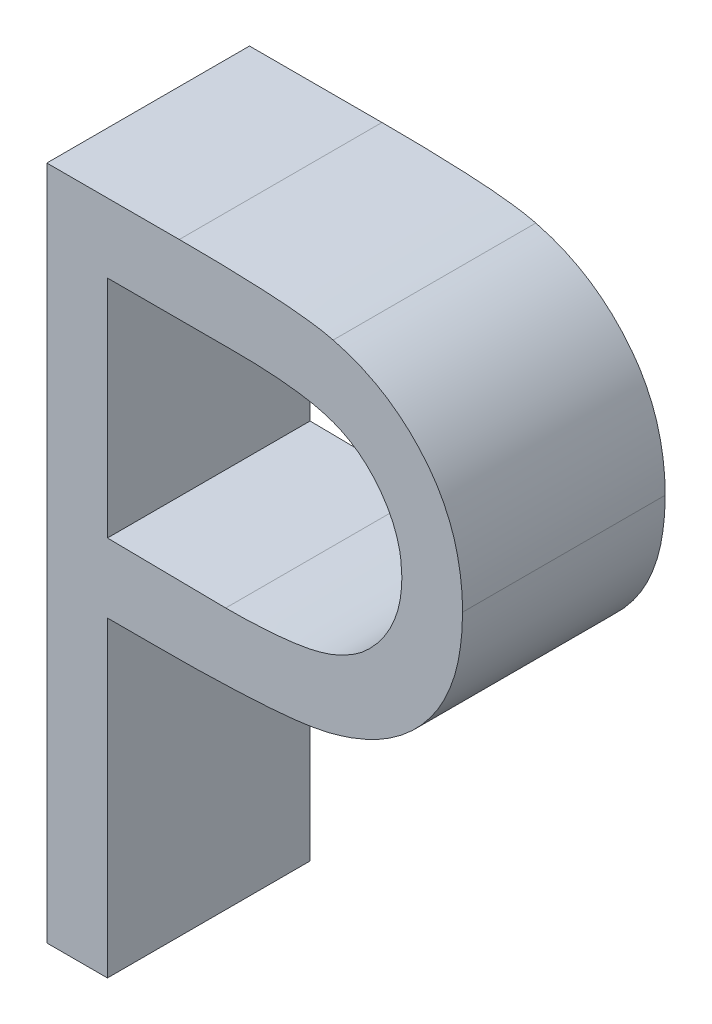
ISO-10303-21;
HEADER;
FILE_DESCRIPTION(('STEP AP214'),'2;1');
FILE_NAME('part.step','',(''),(''),'','','');
FILE_SCHEMA(('AUTOMOTIVE_DESIGN { 1 0 10303 214 1 1 1 1 }'));
ENDSEC;
DATA;
#1=APPLICATION_CONTEXT('core data for automotive mechanical design processes');
#2=APPLICATION_PROTOCOL_DEFINITION('international standard','automotive_design',2000,#1);
#3=PRODUCT_CONTEXT('',#1,'mechanical');
#4=PRODUCT('Part','Part','',(#3));
#5=PRODUCT_RELATED_PRODUCT_CATEGORY('part','',(#4));
#6=PRODUCT_DEFINITION_FORMATION('','',#4);
#7=PRODUCT_DEFINITION_CONTEXT('part definition',#1,'design');
#8=PRODUCT_DEFINITION('design','',#6,#7);
#9=PRODUCT_DEFINITION_SHAPE('','',#8);
#10=(LENGTH_UNIT() NAMED_UNIT(*) SI_UNIT(.MILLI.,.METRE.));
#11=(NAMED_UNIT(*) PLANE_ANGLE_UNIT() SI_UNIT($,.RADIAN.));
#12=(NAMED_UNIT(*) SI_UNIT($,.STERADIAN.) SOLID_ANGLE_UNIT());
#13=UNCERTAINTY_MEASURE_WITH_UNIT(LENGTH_MEASURE(1.E-05),#10,'distance_accuracy_value','');
#14=(GEOMETRIC_REPRESENTATION_CONTEXT(3) GLOBAL_UNCERTAINTY_ASSIGNED_CONTEXT((#13)) GLOBAL_UNIT_ASSIGNED_CONTEXT((#10,
#11,#12)) REPRESENTATION_CONTEXT('',''));
#15=CARTESIAN_POINT('',(0.,0.,0.));
#16=DIRECTION('',(0.,0.,1.));
#17=DIRECTION('',(1.,0.,0.));
#18=AXIS2_PLACEMENT_3D('',#15,#16,#17);
#19=CARTESIAN_POINT('',(-53.880379763694,-17.8818385258969,1.5));
#20=DIRECTION('',(0.,0.,1.));
#21=DIRECTION('',(1.,0.,0.));
#22=AXIS2_PLACEMENT_3D('',#19,#20,#21);
#23=PLANE('',#22);
#24=DIRECTION('',(0.,1.,0.));
#25=VECTOR('',#24,1.);
#26=CARTESIAN_POINT('',(-55.4324653258695,-22.8701190762308,1.5));
#27=LINE('',#26,#25);
#28=CARTESIAN_POINT('',(-55.4324653258695,-22.8701190762308,1.5));
#29=VERTEX_POINT('',#28);
#30=CARTESIAN_POINT('',(-55.4324653258695,-17.8701190762308,1.5));
#31=VERTEX_POINT('',#30);
#32=EDGE_CURVE('E284',#29,#31,#27,.T.);
#33=ORIENTED_EDGE('',*,*,#32,.F.);
#34=DIRECTION('',(-1.,0.,0.));
#35=VECTOR('',#34,1.);
#36=CARTESIAN_POINT('',(-54.9837473771516,-22.8701190762308,1.5));
#37=LINE('',#36,#35);
#38=CARTESIAN_POINT('',(-54.9837473771516,-22.8701190762308,1.5));
#39=VERTEX_POINT('',#38);
#40=EDGE_CURVE('E236',#39,#29,#37,.T.);
#41=ORIENTED_EDGE('',*,*,#40,.F.);
#42=DIRECTION('',(0.,-1.,0.));
#43=VECTOR('',#42,1.);
#44=CARTESIAN_POINT('',(-54.9837473771516,-20.5624267685385,1.5));
#45=LINE('',#44,#43);
#46=CARTESIAN_POINT('',(-54.9837473771516,-20.5624267685385,1.5));
#47=VERTEX_POINT('',#46);
#48=EDGE_CURVE('E233',#47,#39,#45,.T.);
#49=ORIENTED_EDGE('',*,*,#48,.F.);
#50=DIRECTION('',(-1.,0.,0.));
#51=VECTOR('',#50,1.);
#52=CARTESIAN_POINT('',(-54.626175261767,-20.5624267685385,1.5));
#53=LINE('',#52,#51);
#54=CARTESIAN_POINT('',(-54.626175261767,-20.5624267685385,1.5));
#55=VERTEX_POINT('',#54);
#56=EDGE_CURVE('E222',#55,#47,#53,.T.);
#57=ORIENTED_EDGE('',*,*,#56,.F.);
#58=CARTESIAN_POINT('',(-53.3531384027926,-20.4802953582821,1.5));
#59=CARTESIAN_POINT('',(-53.3844631656375,-20.486956759822,1.5));
#60=CARTESIAN_POINT('',(-53.4531132047241,-20.5015556086096,1.5));
#61=CARTESIAN_POINT('',(-53.5661742364066,-20.5178534041023,1.5));
#62=CARTESIAN_POINT('',(-53.6978105020206,-20.5317642622244,1.5));
#63=CARTESIAN_POINT('',(-53.8478423304714,-20.5421944587687,1.5));
#64=CARTESIAN_POINT('',(-54.016135051788,-20.5511235565716,1.5));
#65=CARTESIAN_POINT('',(-54.2027797051161,-20.5582208335583,1.5));
#66=CARTESIAN_POINT('',(-54.4081426725152,-20.5621206247514,1.5));
#67=CARTESIAN_POINT('',(-54.5513873069122,-20.5623217573206,1.5));
#68=CARTESIAN_POINT('',(-54.626175261767,-20.5624267685385,1.5));
#69=B_SPLINE_CURVE_WITH_KNOTS('',3,(#58,#59,#60,#61,#62,#63,#64,#65,#66,#67,#68),.UNSPECIFIED.,
.F.,.F.,(4,1,1,1,1,1,1,1,4),(0.,0.0751731173762235,0.164746257511804,0.268016880987782,
0.385911875652958,0.517789479273397,0.663690977002278,0.82441322053664,1.),.UNSPECIFIED.);
#70=CARTESIAN_POINT('',(-53.3531384027926,-20.4802953582821,1.5));
#71=VERTEX_POINT('',#70);
#72=EDGE_CURVE('E216',#71,#55,#69,.T.);
#73=ORIENTED_EDGE('',*,*,#72,.F.);
#74=CARTESIAN_POINT('',(-52.3555422489465,-19.2112649095642,1.5));
#75=CARTESIAN_POINT('',(-52.3561442842735,-19.2523760192606,1.5));
#76=CARTESIAN_POINT('',(-52.3573222070527,-19.3328126820398,1.5));
#77=CARTESIAN_POINT('',(-52.3714597575224,-19.4504880937379,1.5));
#78=CARTESIAN_POINT('',(-52.3905028884063,-19.5629429367831,1.5));
#79=CARTESIAN_POINT('',(-52.4197843917309,-19.6699278660251,1.5));
#80=CARTESIAN_POINT('',(-52.4581353533,-19.7708075381262,1.5));
#81=CARTESIAN_POINT('',(-52.5031240002224,-19.8671235838701,1.5));
#82=CARTESIAN_POINT('',(-52.557386186465,-19.9572374008681,1.5));
#83=CARTESIAN_POINT('',(-52.6197359431943,-20.0414761402133,1.5));
#84=CARTESIAN_POINT('',(-52.6890953637555,-20.1199188720907,1.5));
#85=CARTESIAN_POINT('',(-52.7651709896802,-20.1919971499374,1.5));
#86=CARTESIAN_POINT('',(-52.847655693252,-20.2572890619696,1.5));
#87=CARTESIAN_POINT('',(-52.9362873333611,-20.315940981513,1.5));
#88=CARTESIAN_POINT('',(-53.0319299745561,-20.3665928093669,1.5));
#89=CARTESIAN_POINT('',(-53.1331330510861,-20.4119603878319,1.5));
#90=CARTESIAN_POINT('',(-53.2407762174031,-20.4500619030298,1.5));
#91=CARTESIAN_POINT('',(-53.3152655230822,-20.4701048479246,1.5));
#92=CARTESIAN_POINT('',(-53.3531384027926,-20.4802953582821,1.5));
#93=B_SPLINE_CURVE_WITH_KNOTS('',3,(#74,#75,#76,#77,#78,#79,#80,#81,#82,#83,#84,#85,#86,#87,#88,
#89,#90,#91,#92),.UNSPECIFIED.,.F.,.F.,(4,1,1,1,1,1,1,1,1,1,1,1,1,1,1,1,4),(0.,
0.0701188944197139,0.137192352785971,0.202016180724751,0.264631406974744,0.326116547145818,
0.386010304667642,0.44581184695768,0.50529769673096,0.564633277726489,0.624282625333839,
0.683902031903749,0.743952770938272,0.805387731007635,0.86838803089628,0.933084028252476,1.),.UNSPECIFIED.);
#94=CARTESIAN_POINT('',(-52.3555422489465,-19.2112649095642,1.5));
#95=VERTEX_POINT('',#94);
#96=EDGE_CURVE('E223',#95,#71,#93,.T.);
#97=ORIENTED_EDGE('',*,*,#96,.F.);
#98=CARTESIAN_POINT('',(-53.3130743002285,-17.9452392685385,1.5));
#99=CARTESIAN_POINT('',(-53.2785121091067,-17.9546991968695,1.5));
#100=CARTESIAN_POINT('',(-53.2102021416608,-17.9733961421544,1.5));
#101=CARTESIAN_POINT('',(-53.111772080087,-18.0108443185482,1.5));
#102=CARTESIAN_POINT('',(-53.0181237294008,-18.055247411656,1.5));
#103=CARTESIAN_POINT('',(-52.9289357887648,-18.1058530400145,1.5));
#104=CARTESIAN_POINT('',(-52.8453042415207,-18.1648324174247,1.5));
#105=CARTESIAN_POINT('',(-52.765981325855,-18.2297947284808,1.5));
#106=CARTESIAN_POINT('',(-52.6916670682897,-18.3022398264414,1.5));
#107=CARTESIAN_POINT('',(-52.622779365598,-18.3813551690806,1.5));
#108=CARTESIAN_POINT('',(-52.5595153690495,-18.4658126117684,1.5));
#109=CARTESIAN_POINT('',(-52.505044393725,-18.5568729402077,1.5));
#110=CARTESIAN_POINT('',(-52.4594340693917,-18.6530033736646,1.5));
#111=CARTESIAN_POINT('',(-52.4203151101286,-18.7541370467465,1.5));
#112=CARTESIAN_POINT('',(-52.3921601751726,-18.8611232231627,1.5));
#113=CARTESIAN_POINT('',(-52.3709503184506,-18.9732185265544,1.5));
#114=CARTESIAN_POINT('',(-52.3574879932854,-19.090410941128,1.5));
#115=CARTESIAN_POINT('',(-52.3561986193494,-19.1704964661578,1.5));
#116=CARTESIAN_POINT('',(-52.3555422489465,-19.2112649095642,1.5));
#117=B_SPLINE_CURVE_WITH_KNOTS('',3,(#98,#99,#100,#101,#102,#103,#104,#105,#106,#107,#108,#109,
#110,#111,#112,#113,#114,#115,#116),.UNSPECIFIED.,.F.,.F.,(4,1,1,1,1,1,1,1,1,1,1,1,1,1,1,1,4),
(0.,0.0624813386352062,0.123490382687291,0.183411094206312,0.243153220999781,0.302126735372086,
0.361709670832908,0.421842291694879,0.482931901446669,0.544552254431324,0.605680719965359,
0.667679738343688,0.729984387538063,0.794550921286128,0.860345619712081,0.928907356265708,1.),.UNSPECIFIED.);
#118=CARTESIAN_POINT('',(-53.3130743002285,-17.9452392685385,1.5));
#119=VERTEX_POINT('',#118);
#120=EDGE_CURVE('E322',#119,#95,#117,.T.);
#121=ORIENTED_EDGE('',*,*,#120,.F.);
#122=CARTESIAN_POINT('',(-54.4518964156131,-17.8701190762308,1.5));
#123=CARTESIAN_POINT('',(-54.3844522639679,-17.8701932137177,1.5));
#124=CARTESIAN_POINT('',(-54.2552262742383,-17.8703352644351,1.5));
#125=CARTESIAN_POINT('',(-54.0699190517971,-17.874642044186,1.5));
#126=CARTESIAN_POINT('',(-53.901619435188,-17.8803944614614,1.5));
#127=CARTESIAN_POINT('',(-53.7506903195784,-17.8883685945944,1.5));
#128=CARTESIAN_POINT('',(-53.6166673223119,-17.897792294948,1.5));
#129=CARTESIAN_POINT('',(-53.5001568943882,-17.9110094940586,1.5));
#130=CARTESIAN_POINT('',(-53.4002432424827,-17.9248099162777,1.5));
#131=CARTESIAN_POINT('',(-53.3403768861305,-17.9388404970197,1.5));
#132=CARTESIAN_POINT('',(-53.3130743002285,-17.9452392685385,1.5));
#133=B_SPLINE_CURVE_WITH_KNOTS('',3,(#122,#123,#124,#125,#126,#127,#128,#129,#130,#131,#132),
.UNSPECIFIED.,.F.,.F.,(4,1,1,1,1,1,1,1,4),(0.,0.176955752131251,0.339055079642578,
0.486318224942078,0.618780922835379,0.735618827767378,0.838742476720111,0.926457067876317,1.),.UNSPECIFIED.);
#134=CARTESIAN_POINT('',(-54.4518964156131,-17.8701190762308,1.5));
#135=VERTEX_POINT('',#134);
#136=EDGE_CURVE('E314',#135,#119,#133,.T.);
#137=ORIENTED_EDGE('',*,*,#136,.F.);
#138=DIRECTION('',(1.,0.,0.));
#139=VECTOR('',#138,1.);
#140=CARTESIAN_POINT('',(-55.4324653258695,-17.8701190762308,1.5));
#141=LINE('',#140,#139);
#142=EDGE_CURVE('E312',#31,#135,#141,.T.);
#143=ORIENTED_EDGE('',*,*,#142,.F.);
#144=EDGE_LOOP('',(#33,#41,#49,#57,#73,#97,#121,#137,#143));
#145=FACE_BOUND('',#144,.T.);
#146=DIRECTION('',(0.,-1.,0.));
#147=VECTOR('',#146,1.);
#148=CARTESIAN_POINT('',(-54.9837473771516,-18.3829395890513,1.5));
#149=LINE('',#148,#147);
#150=CARTESIAN_POINT('',(-54.9837473771516,-18.3829395890513,1.5));
#151=VERTEX_POINT('',#150);
#152=CARTESIAN_POINT('',(-54.9837473771516,-20.049606255718,1.5));
#153=VERTEX_POINT('',#152);
#154=EDGE_CURVE('E143',#151,#153,#149,.T.);
#155=ORIENTED_EDGE('',*,*,#154,.F.);
#156=DIRECTION('',(-1.,0.,0.));
#157=VECTOR('',#156,1.);
#158=CARTESIAN_POINT('',(-54.0692842361259,-18.3829395890513,1.5));
#159=LINE('',#158,#157);
#160=CARTESIAN_POINT('',(-54.0692842361259,-18.3829395890513,1.5));
#161=VERTEX_POINT('',#160);
#162=EDGE_CURVE('E135',#161,#151,#159,.T.);
#163=ORIENTED_EDGE('',*,*,#162,.F.);
#164=CARTESIAN_POINT('',(-52.8042601976644,-19.2132681146924,1.5));
#165=CARTESIAN_POINT('',(-52.8060639783723,-19.1730702383368,1.5));
#166=CARTESIAN_POINT('',(-52.8096496711736,-19.0931618352571,1.5));
#167=CARTESIAN_POINT('',(-52.8363009042603,-18.9760493201003,1.5));
#168=CARTESIAN_POINT('',(-52.881085638351,-18.8642840281192,1.5));
#169=CARTESIAN_POINT('',(-52.943166487658,-18.7600367633286,1.5));
#170=CARTESIAN_POINT('',(-53.0185109590303,-18.6654813290925,1.5));
#171=CARTESIAN_POINT('',(-53.1060814491846,-18.5833425761456,1.5));
#172=CARTESIAN_POINT('',(-53.2056718225184,-18.517311572244,1.5));
#173=CARTESIAN_POINT('',(-53.2983121525652,-18.4746925984602,1.5));
#174=CARTESIAN_POINT('',(-53.3805995611758,-18.4486707764128,1.5));
#175=CARTESIAN_POINT('',(-53.4520737895812,-18.4304638614739,1.5));
#176=CARTESIAN_POINT('',(-53.5327747531331,-18.415927281124,1.5));
#177=CARTESIAN_POINT('',(-53.6227287238622,-18.4041565628437,1.5));
#178=CARTESIAN_POINT('',(-53.7212384865485,-18.3940801896675,1.5));
#179=CARTESIAN_POINT('',(-53.8291503649694,-18.3872430793332,1.5));
#180=CARTESIAN_POINT('',(-53.9460555696328,-18.3832409989953,1.5));
#181=CARTESIAN_POINT('',(-54.0272135280114,-18.3830424914858,1.5));
#182=CARTESIAN_POINT('',(-54.0692842361259,-18.3829395890513,1.5));
#183=B_SPLINE_CURVE_WITH_KNOTS('',3,(#164,#165,#166,#167,#168,#169,#170,#171,#172,#173,#174,
#175,#176,#177,#178,#179,#180,#181,#182),.UNSPECIFIED.,.F.,.F.,(4,1,1,1,1,1,1,1,1,1,1,1,1,1,1,1,
4),(0.,0.0700437554181556,0.139238316762646,0.208197455044138,0.279173374424568,
0.349986811686477,0.418353845662657,0.487609583757152,0.557411073108388,0.595330156763242,
0.637964051565221,0.685912777711294,0.73818516465248,0.796102647184943,0.858516543946926,
0.926657726468521,1.),.UNSPECIFIED.);
#184=CARTESIAN_POINT('',(-52.8042601976644,-19.2132681146924,1.5));
#185=VERTEX_POINT('',#184);
#186=EDGE_CURVE('E165',#185,#161,#183,.T.);
#187=ORIENTED_EDGE('',*,*,#186,.F.);
#188=CARTESIAN_POINT('',(-54.1083467361259,-20.0606238839231,1.5));
#189=CARTESIAN_POINT('',(-54.0656039849647,-20.0606459747676,1.5));
#190=CARTESIAN_POINT('',(-53.9830899850608,-20.0606886206875,1.5));
#191=CARTESIAN_POINT('',(-53.8638953804419,-20.0549954442886,1.5));
#192=CARTESIAN_POINT('',(-53.7533106842946,-20.048423254768,1.5));
#193=CARTESIAN_POINT('',(-53.6516755766185,-20.0388005069652,1.5));
#194=CARTESIAN_POINT('',(-53.5589442416423,-20.0251987105592,1.5));
#195=CARTESIAN_POINT('',(-53.474962057536,-20.0114676563904,1.5));
#196=CARTESIAN_POINT('',(-53.4003802248289,-19.9916028526782,1.5));
#197=CARTESIAN_POINT('',(-53.3130956508778,-19.9648556110509,1.5));
#198=CARTESIAN_POINT('',(-53.2158337259109,-19.919237588678,1.5));
#199=CARTESIAN_POINT('',(-53.1100229423063,-19.8530234600301,1.5));
#200=CARTESIAN_POINT('',(-53.0203506760902,-19.7686224483157,1.5));
#201=CARTESIAN_POINT('',(-52.942753109288,-19.6737255464207,1.5));
#202=CARTESIAN_POINT('',(-52.8811732836617,-19.5681553615263,1.5));
#203=CARTESIAN_POINT('',(-52.8360932946382,-19.455199737632,1.5));
#204=CARTESIAN_POINT('',(-52.809605926976,-19.3360170954581,1.5));
#205=CARTESIAN_POINT('',(-52.8060542217536,-19.2544626113793,1.5));
#206=CARTESIAN_POINT('',(-52.8042601976644,-19.2132681146924,1.5));
#207=B_SPLINE_CURVE_WITH_KNOTS('',3,(#188,#189,#190,#191,#192,#193,#194,#195,#196,#197,#198,
#199,#200,#201,#202,#203,#204,#205,#206),.UNSPECIFIED.,.F.,.F.,(4,1,1,1,1,1,1,1,1,1,1,1,1,1,1,1,
4),(0.,0.0725383714064926,0.14003383050125,0.202495680633622,0.260575055669414,
0.313228337846465,0.361583193753266,0.404878361295125,0.44412743730554,0.516399693337197,
0.586506670997767,0.655085373796049,0.724383783147036,0.793973528725663,0.861637682181778,
0.930110942306403,1.),.UNSPECIFIED.);
#208=CARTESIAN_POINT('',(-54.1083467361259,-20.0606238839231,1.5));
#209=VERTEX_POINT('',#208);
#210=EDGE_CURVE('E158',#209,#185,#207,.T.);
#211=ORIENTED_EDGE('',*,*,#210,.F.);
#212=DIRECTION('',(0.999920808071693,-0.0125848156622303,0.));
#213=VECTOR('',#212,1.);
#214=CARTESIAN_POINT('',(-54.9837473771516,-20.049606255718,1.5));
#215=LINE('',#214,#213);
#216=EDGE_CURVE('E156',#153,#209,#215,.T.);
#217=ORIENTED_EDGE('',*,*,#216,.F.);
#218=EDGE_LOOP('',(#155,#163,#187,#211,#217));
#219=FACE_BOUND('',#218,.T.);
#220=ADVANCED_FACE('F33',(#145,#219),#23,.T.);
#221=CARTESIAN_POINT('',(-53.880379763694,-17.8818385258969,0.));
#222=DIRECTION('',(0.,0.,1.));
#223=DIRECTION('',(1.,0.,0.));
#224=AXIS2_PLACEMENT_3D('',#221,#222,#223);
#225=PLANE('',#224);
#226=DIRECTION('',(0.,1.,0.));
#227=VECTOR('',#226,1.);
#228=CARTESIAN_POINT('',(-55.4324653258695,-22.8701190762308,0.));
#229=LINE('',#228,#227);
#230=CARTESIAN_POINT('',(-55.4324653258695,-22.8701190762308,0.));
#231=VERTEX_POINT('',#230);
#232=CARTESIAN_POINT('',(-55.4324653258695,-17.8701190762308,0.));
#233=VERTEX_POINT('',#232);
#234=EDGE_CURVE('E151',#231,#233,#229,.T.);
#235=ORIENTED_EDGE('',*,*,#234,.T.);
#236=DIRECTION('',(1.,0.,0.));
#237=VECTOR('',#236,1.);
#238=CARTESIAN_POINT('',(-55.4324653258695,-17.8701190762308,0.));
#239=LINE('',#238,#237);
#240=CARTESIAN_POINT('',(-54.4518964156131,-17.8701190762308,0.));
#241=VERTEX_POINT('',#240);
#242=EDGE_CURVE('E241',#233,#241,#239,.T.);
#243=ORIENTED_EDGE('',*,*,#242,.T.);
#244=CARTESIAN_POINT('',(-54.4518964156131,-17.8701190762308,0.));
#245=CARTESIAN_POINT('',(-54.3844522639679,-17.8701932137177,0.));
#246=CARTESIAN_POINT('',(-54.2552262742383,-17.8703352644351,0.));
#247=CARTESIAN_POINT('',(-54.0699190517971,-17.874642044186,0.));
#248=CARTESIAN_POINT('',(-53.901619435188,-17.8803944614614,0.));
#249=CARTESIAN_POINT('',(-53.7506903195784,-17.8883685945944,0.));
#250=CARTESIAN_POINT('',(-53.6166673223119,-17.897792294948,0.));
#251=CARTESIAN_POINT('',(-53.5001568943882,-17.9110094940586,0.));
#252=CARTESIAN_POINT('',(-53.4002432424827,-17.9248099162777,0.));
#253=CARTESIAN_POINT('',(-53.3403768861305,-17.9388404970197,0.));
#254=CARTESIAN_POINT('',(-53.3130743002285,-17.9452392685385,0.));
#255=B_SPLINE_CURVE_WITH_KNOTS('',3,(#244,#245,#246,#247,#248,#249,#250,#251,#252,#253,#254),
.UNSPECIFIED.,.F.,.F.,(4,1,1,1,1,1,1,1,4),(0.,0.176955752131251,0.339055079642578,
0.486318224942078,0.618780922835379,0.735618827767378,0.838742476720111,0.926457067876317,1.),.UNSPECIFIED.);
#256=CARTESIAN_POINT('',(-53.3130743002285,-17.9452392685385,0.));
#257=VERTEX_POINT('',#256);
#258=EDGE_CURVE('E244',#241,#257,#255,.T.);
#259=ORIENTED_EDGE('',*,*,#258,.T.);
#260=CARTESIAN_POINT('',(-53.3130743002285,-17.9452392685385,0.));
#261=CARTESIAN_POINT('',(-53.2785121091067,-17.9546991968695,0.));
#262=CARTESIAN_POINT('',(-53.2102021416608,-17.9733961421544,0.));
#263=CARTESIAN_POINT('',(-53.111772080087,-18.0108443185482,0.));
#264=CARTESIAN_POINT('',(-53.0181237294008,-18.055247411656,0.));
#265=CARTESIAN_POINT('',(-52.9289357887648,-18.1058530400145,0.));
#266=CARTESIAN_POINT('',(-52.8453042415207,-18.1648324174247,0.));
#267=CARTESIAN_POINT('',(-52.765981325855,-18.2297947284808,0.));
#268=CARTESIAN_POINT('',(-52.6916670682897,-18.3022398264414,0.));
#269=CARTESIAN_POINT('',(-52.622779365598,-18.3813551690806,0.));
#270=CARTESIAN_POINT('',(-52.5595153690495,-18.4658126117684,0.));
#271=CARTESIAN_POINT('',(-52.505044393725,-18.5568729402077,0.));
#272=CARTESIAN_POINT('',(-52.4594340693917,-18.6530033736646,0.));
#273=CARTESIAN_POINT('',(-52.4203151101286,-18.7541370467465,0.));
#274=CARTESIAN_POINT('',(-52.3921601751726,-18.8611232231627,0.));
#275=CARTESIAN_POINT('',(-52.3709503184506,-18.9732185265544,0.));
#276=CARTESIAN_POINT('',(-52.3574879932854,-19.090410941128,0.));
#277=CARTESIAN_POINT('',(-52.3561986193494,-19.1704964661578,0.));
#278=CARTESIAN_POINT('',(-52.3555422489465,-19.2112649095642,0.));
#279=B_SPLINE_CURVE_WITH_KNOTS('',3,(#260,#261,#262,#263,#264,#265,#266,#267,#268,#269,#270,
#271,#272,#273,#274,#275,#276,#277,#278),.UNSPECIFIED.,.F.,.F.,(4,1,1,1,1,1,1,1,1,1,1,1,1,1,1,1,
4),(0.,0.0624813386352062,0.123490382687291,0.183411094206312,0.243153220999781,
0.302126735372086,0.361709670832908,0.421842291694879,0.482931901446669,0.544552254431324,
0.605680719965359,0.667679738343688,0.729984387538063,0.794550921286128,0.860345619712081,
0.928907356265708,1.),.UNSPECIFIED.);
#280=CARTESIAN_POINT('',(-52.3555422489465,-19.2112649095642,0.));
#281=VERTEX_POINT('',#280);
#282=EDGE_CURVE('E249',#257,#281,#279,.T.);
#283=ORIENTED_EDGE('',*,*,#282,.T.);
#284=CARTESIAN_POINT('',(-52.3555422489465,-19.2112649095642,0.));
#285=CARTESIAN_POINT('',(-52.3561442842735,-19.2523760192606,0.));
#286=CARTESIAN_POINT('',(-52.3573222070527,-19.3328126820398,0.));
#287=CARTESIAN_POINT('',(-52.3714597575224,-19.4504880937379,0.));
#288=CARTESIAN_POINT('',(-52.3905028884063,-19.5629429367831,0.));
#289=CARTESIAN_POINT('',(-52.4197843917309,-19.6699278660251,0.));
#290=CARTESIAN_POINT('',(-52.4581353533,-19.7708075381262,0.));
#291=CARTESIAN_POINT('',(-52.5031240002224,-19.8671235838701,0.));
#292=CARTESIAN_POINT('',(-52.557386186465,-19.9572374008681,0.));
#293=CARTESIAN_POINT('',(-52.6197359431943,-20.0414761402133,0.));
#294=CARTESIAN_POINT('',(-52.6890953637555,-20.1199188720907,0.));
#295=CARTESIAN_POINT('',(-52.7651709896802,-20.1919971499374,0.));
#296=CARTESIAN_POINT('',(-52.847655693252,-20.2572890619696,0.));
#297=CARTESIAN_POINT('',(-52.9362873333611,-20.315940981513,0.));
#298=CARTESIAN_POINT('',(-53.0319299745561,-20.3665928093669,0.));
#299=CARTESIAN_POINT('',(-53.1331330510861,-20.4119603878319,0.));
#300=CARTESIAN_POINT('',(-53.2407762174031,-20.4500619030298,0.));
#301=CARTESIAN_POINT('',(-53.3152655230822,-20.4701048479246,0.));
#302=CARTESIAN_POINT('',(-53.3531384027926,-20.4802953582821,0.));
#303=B_SPLINE_CURVE_WITH_KNOTS('',3,(#284,#285,#286,#287,#288,#289,#290,#291,#292,#293,#294,
#295,#296,#297,#298,#299,#300,#301,#302),.UNSPECIFIED.,.F.,.F.,(4,1,1,1,1,1,1,1,1,1,1,1,1,1,1,1,
4),(0.,0.0701188944197139,0.137192352785971,0.202016180724751,0.264631406974744,
0.326116547145818,0.386010304667642,0.44581184695768,0.50529769673096,0.564633277726489,
0.624282625333839,0.683902031903749,0.743952770938272,0.805387731007635,0.86838803089628,
0.933084028252476,1.),.UNSPECIFIED.);
#304=CARTESIAN_POINT('',(-53.3531384027926,-20.4802953582821,0.));
#305=VERTEX_POINT('',#304);
#306=EDGE_CURVE('E257',#281,#305,#303,.T.);
#307=ORIENTED_EDGE('',*,*,#306,.T.);
#308=CARTESIAN_POINT('',(-53.3531384027926,-20.4802953582821,0.));
#309=CARTESIAN_POINT('',(-53.3844631656375,-20.486956759822,0.));
#310=CARTESIAN_POINT('',(-53.4531132047241,-20.5015556086096,0.));
#311=CARTESIAN_POINT('',(-53.5661742364066,-20.5178534041023,0.));
#312=CARTESIAN_POINT('',(-53.6978105020206,-20.5317642622244,0.));
#313=CARTESIAN_POINT('',(-53.8478423304714,-20.5421944587687,0.));
#314=CARTESIAN_POINT('',(-54.016135051788,-20.5511235565716,0.));
#315=CARTESIAN_POINT('',(-54.2027797051161,-20.5582208335583,0.));
#316=CARTESIAN_POINT('',(-54.4081426725152,-20.5621206247514,0.));
#317=CARTESIAN_POINT('',(-54.5513873069122,-20.5623217573206,0.));
#318=CARTESIAN_POINT('',(-54.626175261767,-20.5624267685385,0.));
#319=B_SPLINE_CURVE_WITH_KNOTS('',3,(#308,#309,#310,#311,#312,#313,#314,#315,#316,#317,#318),
.UNSPECIFIED.,.F.,.F.,(4,1,1,1,1,1,1,1,4),(0.,0.0751731173762235,0.164746257511804,
0.268016880987782,0.385911875652958,0.517789479273397,0.663690977002278,0.82441322053664,1.),.UNSPECIFIED.);
#320=CARTESIAN_POINT('',(-54.626175261767,-20.5624267685385,0.));
#321=VERTEX_POINT('',#320);
#322=EDGE_CURVE('E265',#305,#321,#319,.T.);
#323=ORIENTED_EDGE('',*,*,#322,.T.);
#324=DIRECTION('',(-1.,0.,0.));
#325=VECTOR('',#324,1.);
#326=CARTESIAN_POINT('',(-54.626175261767,-20.5624267685385,0.));
#327=LINE('',#326,#325);
#328=CARTESIAN_POINT('',(-54.9837473771516,-20.5624267685385,0.));
#329=VERTEX_POINT('',#328);
#330=EDGE_CURVE('E273',#321,#329,#327,.T.);
#331=ORIENTED_EDGE('',*,*,#330,.T.);
#332=DIRECTION('',(0.,-1.,0.));
#333=VECTOR('',#332,1.);
#334=CARTESIAN_POINT('',(-54.9837473771516,-20.5624267685385,0.));
#335=LINE('',#334,#333);
#336=CARTESIAN_POINT('',(-54.9837473771516,-22.8701190762308,0.));
#337=VERTEX_POINT('',#336);
#338=EDGE_CURVE('E279',#329,#337,#335,.T.);
#339=ORIENTED_EDGE('',*,*,#338,.T.);
#340=DIRECTION('',(-1.,0.,0.));
#341=VECTOR('',#340,1.);
#342=CARTESIAN_POINT('',(-54.9837473771516,-22.8701190762308,0.));
#343=LINE('',#342,#341);
#344=EDGE_CURVE('E282',#337,#231,#343,.T.);
#345=ORIENTED_EDGE('',*,*,#344,.T.);
#346=EDGE_LOOP('',(#235,#243,#259,#283,#307,#323,#331,#339,#345));
#347=FACE_BOUND('',#346,.T.);
#348=DIRECTION('',(-1.,0.,0.));
#349=VECTOR('',#348,1.);
#350=CARTESIAN_POINT('',(-54.0692842361259,-18.3829395890513,0.));
#351=LINE('',#350,#349);
#352=CARTESIAN_POINT('',(-54.0692842361259,-18.3829395890513,0.));
#353=VERTEX_POINT('',#352);
#354=CARTESIAN_POINT('',(-54.9837473771516,-18.3829395890513,0.));
#355=VERTEX_POINT('',#354);
#356=EDGE_CURVE('E58',#353,#355,#351,.T.);
#357=ORIENTED_EDGE('',*,*,#356,.T.);
#358=DIRECTION('',(0.,-1.,0.));
#359=VECTOR('',#358,1.);
#360=CARTESIAN_POINT('',(-54.9837473771516,-18.3829395890513,0.));
#361=LINE('',#360,#359);
#362=CARTESIAN_POINT('',(-54.9837473771516,-20.049606255718,0.));
#363=VERTEX_POINT('',#362);
#364=EDGE_CURVE('E150',#355,#363,#361,.T.);
#365=ORIENTED_EDGE('',*,*,#364,.T.);
#366=DIRECTION('',(0.999920808071693,-0.0125848156622303,0.));
#367=VECTOR('',#366,1.);
#368=CARTESIAN_POINT('',(-54.9837473771516,-20.049606255718,0.));
#369=LINE('',#368,#367);
#370=CARTESIAN_POINT('',(-54.1083467361259,-20.0606238839231,0.));
#371=VERTEX_POINT('',#370);
#372=EDGE_CURVE('E478',#363,#371,#369,.T.);
#373=ORIENTED_EDGE('',*,*,#372,.T.);
#374=CARTESIAN_POINT('',(-54.1083467361259,-20.0606238839231,0.));
#375=CARTESIAN_POINT('',(-54.0656039849647,-20.0606459747676,0.));
#376=CARTESIAN_POINT('',(-53.9830899850608,-20.0606886206875,0.));
#377=CARTESIAN_POINT('',(-53.8638953804419,-20.0549954442886,0.));
#378=CARTESIAN_POINT('',(-53.7533106842946,-20.048423254768,0.));
#379=CARTESIAN_POINT('',(-53.6516755766185,-20.0388005069652,0.));
#380=CARTESIAN_POINT('',(-53.5589442416423,-20.0251987105592,0.));
#381=CARTESIAN_POINT('',(-53.474962057536,-20.0114676563904,0.));
#382=CARTESIAN_POINT('',(-53.4003802248289,-19.9916028526782,0.));
#383=CARTESIAN_POINT('',(-53.3130956508778,-19.9648556110509,0.));
#384=CARTESIAN_POINT('',(-53.2158337259109,-19.919237588678,0.));
#385=CARTESIAN_POINT('',(-53.1100229423063,-19.8530234600301,0.));
#386=CARTESIAN_POINT('',(-53.0203506760902,-19.7686224483157,0.));
#387=CARTESIAN_POINT('',(-52.942753109288,-19.6737255464207,0.));
#388=CARTESIAN_POINT('',(-52.8811732836617,-19.5681553615263,0.));
#389=CARTESIAN_POINT('',(-52.8360932946382,-19.455199737632,0.));
#390=CARTESIAN_POINT('',(-52.809605926976,-19.3360170954581,0.));
#391=CARTESIAN_POINT('',(-52.8060542217536,-19.2544626113793,0.));
#392=CARTESIAN_POINT('',(-52.8042601976644,-19.2132681146924,0.));
#393=B_SPLINE_CURVE_WITH_KNOTS('',3,(#374,#375,#376,#377,#378,#379,#380,#381,#382,#383,#384,
#385,#386,#387,#388,#389,#390,#391,#392),.UNSPECIFIED.,.F.,.F.,(4,1,1,1,1,1,1,1,1,1,1,1,1,1,1,1,
4),(0.,0.0725383714064926,0.14003383050125,0.202495680633622,0.260575055669414,
0.313228337846465,0.361583193753266,0.404878361295125,0.44412743730554,0.516399693337197,
0.586506670997767,0.655085373796049,0.724383783147036,0.793973528725663,0.861637682181778,
0.930110942306403,1.),.UNSPECIFIED.);
#394=CARTESIAN_POINT('',(-52.8042601976644,-19.2132681146924,0.));
#395=VERTEX_POINT('',#394);
#396=EDGE_CURVE('E473',#371,#395,#393,.T.);
#397=ORIENTED_EDGE('',*,*,#396,.T.);
#398=CARTESIAN_POINT('',(-52.8042601976644,-19.2132681146924,0.));
#399=CARTESIAN_POINT('',(-52.8060639783723,-19.1730702383368,0.));
#400=CARTESIAN_POINT('',(-52.8096496711736,-19.0931618352571,0.));
#401=CARTESIAN_POINT('',(-52.8363009042603,-18.9760493201003,0.));
#402=CARTESIAN_POINT('',(-52.881085638351,-18.8642840281192,0.));
#403=CARTESIAN_POINT('',(-52.943166487658,-18.7600367633286,0.));
#404=CARTESIAN_POINT('',(-53.0185109590303,-18.6654813290925,0.));
#405=CARTESIAN_POINT('',(-53.1060814491846,-18.5833425761456,0.));
#406=CARTESIAN_POINT('',(-53.2056718225184,-18.517311572244,0.));
#407=CARTESIAN_POINT('',(-53.2983121525652,-18.4746925984602,0.));
#408=CARTESIAN_POINT('',(-53.3805995611758,-18.4486707764128,0.));
#409=CARTESIAN_POINT('',(-53.4520737895812,-18.4304638614739,0.));
#410=CARTESIAN_POINT('',(-53.5327747531331,-18.415927281124,0.));
#411=CARTESIAN_POINT('',(-53.6227287238622,-18.4041565628437,0.));
#412=CARTESIAN_POINT('',(-53.7212384865485,-18.3940801896675,0.));
#413=CARTESIAN_POINT('',(-53.8291503649694,-18.3872430793332,0.));
#414=CARTESIAN_POINT('',(-53.9460555696328,-18.3832409989953,0.));
#415=CARTESIAN_POINT('',(-54.0272135280114,-18.3830424914858,0.));
#416=CARTESIAN_POINT('',(-54.0692842361259,-18.3829395890513,0.));
#417=B_SPLINE_CURVE_WITH_KNOTS('',3,(#398,#399,#400,#401,#402,#403,#404,#405,#406,#407,#408,
#409,#410,#411,#412,#413,#414,#415,#416),.UNSPECIFIED.,.F.,.F.,(4,1,1,1,1,1,1,1,1,1,1,1,1,1,1,1,
4),(0.,0.0700437554181556,0.139238316762646,0.208197455044138,0.279173374424568,
0.349986811686477,0.418353845662657,0.487609583757152,0.557411073108388,0.595330156763242,
0.637964051565221,0.685912777711294,0.73818516465248,0.796102647184943,0.858516543946926,
0.926657726468521,1.),.UNSPECIFIED.);
#418=EDGE_CURVE('E144',#395,#353,#417,.T.);
#419=ORIENTED_EDGE('',*,*,#418,.T.);
#420=EDGE_LOOP('',(#357,#365,#373,#397,#419));
#421=FACE_BOUND('',#420,.T.);
#422=ADVANCED_FACE('F191',(#347,#421),#225,.F.);
#423=CARTESIAN_POINT('',(-55.4324653258695,-22.8701190762308,1.5));
#424=DIRECTION('',(-1.,0.,0.));
#425=DIRECTION('',(0.,0.,1.));
#426=AXIS2_PLACEMENT_3D('',#423,#424,#425);
#427=PLANE('',#426);
#428=ORIENTED_EDGE('',*,*,#234,.F.);
#429=DIRECTION('',(0.,0.,-1.));
#430=VECTOR('',#429,1.);
#431=CARTESIAN_POINT('',(-55.4324653258695,-22.8701190762308,1.5));
#432=LINE('',#431,#430);
#433=EDGE_CURVE('E11',#29,#231,#432,.T.);
#434=ORIENTED_EDGE('',*,*,#433,.F.);
#435=ORIENTED_EDGE('',*,*,#32,.T.);
#436=DIRECTION('',(0.,0.,-1.));
#437=VECTOR('',#436,1.);
#438=CARTESIAN_POINT('',(-55.4324653258695,-17.8701190762308,1.5));
#439=LINE('',#438,#437);
#440=EDGE_CURVE('E37',#31,#233,#439,.T.);
#441=ORIENTED_EDGE('',*,*,#440,.T.);
#442=EDGE_LOOP('',(#428,#434,#435,#441));
#443=FACE_BOUND('',#442,.T.);
#444=ADVANCED_FACE('F35',(#443),#427,.T.);
#445=CARTESIAN_POINT('',(-54.9837473771516,-22.8701190762308,1.5));
#446=DIRECTION('',(0.,-1.,0.));
#447=DIRECTION('',(0.,0.,-1.));
#448=AXIS2_PLACEMENT_3D('',#445,#446,#447);
#449=PLANE('',#448);
#450=ORIENTED_EDGE('',*,*,#344,.F.);
#451=DIRECTION('',(0.,0.,-1.));
#452=VECTOR('',#451,1.);
#453=CARTESIAN_POINT('',(-54.9837473771516,-22.8701190762308,1.5));
#454=LINE('',#453,#452);
#455=EDGE_CURVE('E42',#39,#337,#454,.T.);
#456=ORIENTED_EDGE('',*,*,#455,.F.);
#457=ORIENTED_EDGE('',*,*,#40,.T.);
#458=ORIENTED_EDGE('',*,*,#433,.T.);
#459=EDGE_LOOP('',(#450,#456,#457,#458));
#460=FACE_BOUND('',#459,.T.);
#461=ADVANCED_FACE('F196',(#460),#449,.T.);
#462=CARTESIAN_POINT('',(-54.9837473771516,-20.5624267685385,1.5));
#463=DIRECTION('',(1.,0.,0.));
#464=DIRECTION('',(0.,0.,-1.));
#465=AXIS2_PLACEMENT_3D('',#462,#463,#464);
#466=PLANE('',#465);
#467=ORIENTED_EDGE('',*,*,#338,.F.);
#468=DIRECTION('',(0.,0.,-1.));
#469=VECTOR('',#468,1.);
#470=CARTESIAN_POINT('',(-54.9837473771516,-20.5624267685385,1.5));
#471=LINE('',#470,#469);
#472=EDGE_CURVE('E287',#47,#329,#471,.T.);
#473=ORIENTED_EDGE('',*,*,#472,.F.);
#474=ORIENTED_EDGE('',*,*,#48,.T.);
#475=ORIENTED_EDGE('',*,*,#455,.T.);
#476=EDGE_LOOP('',(#467,#473,#474,#475));
#477=FACE_BOUND('',#476,.T.);
#478=ADVANCED_FACE('F199',(#477),#466,.T.);
#479=CARTESIAN_POINT('',(-54.626175261767,-20.5624267685385,1.5));
#480=DIRECTION('',(0.,-1.,0.));
#481=DIRECTION('',(0.,0.,-1.));
#482=AXIS2_PLACEMENT_3D('',#479,#480,#481);
#483=PLANE('',#482);
#484=ORIENTED_EDGE('',*,*,#330,.F.);
#485=DIRECTION('',(0.,0.,-1.));
#486=VECTOR('',#485,1.);
#487=CARTESIAN_POINT('',(-54.626175261767,-20.5624267685385,1.5));
#488=LINE('',#487,#486);
#489=EDGE_CURVE('E289',#55,#321,#488,.T.);
#490=ORIENTED_EDGE('',*,*,#489,.F.);
#491=ORIENTED_EDGE('',*,*,#56,.T.);
#492=ORIENTED_EDGE('',*,*,#472,.T.);
#493=EDGE_LOOP('',(#484,#490,#491,#492));
#494=FACE_BOUND('',#493,.T.);
#495=ADVANCED_FACE('F203',(#494),#483,.T.);
#496=DIRECTION('',(0.,0.,-1.));
#497=VECTOR('',#496,1.);
#498=SURFACE_OF_LINEAR_EXTRUSION('',#69,#497);
#499=ORIENTED_EDGE('',*,*,#322,.F.);
#500=DIRECTION('',(0.,0.,-1.));
#501=VECTOR('',#500,1.);
#502=CARTESIAN_POINT('',(-53.3531384027926,-20.4802953582821,1.5));
#503=LINE('',#502,#501);
#504=EDGE_CURVE('E291',#71,#305,#503,.T.);
#505=ORIENTED_EDGE('',*,*,#504,.F.);
#506=ORIENTED_EDGE('',*,*,#72,.T.);
#507=ORIENTED_EDGE('',*,*,#489,.T.);
#508=EDGE_LOOP('',(#499,#505,#506,#507));
#509=FACE_BOUND('',#508,.T.);
#510=ADVANCED_FACE('F207',(#509),#498,.T.);
#511=DIRECTION('',(0.,0.,-1.));
#512=VECTOR('',#511,1.);
#513=SURFACE_OF_LINEAR_EXTRUSION('',#93,#512);
#514=ORIENTED_EDGE('',*,*,#306,.F.);
#515=DIRECTION('',(0.,0.,-1.));
#516=VECTOR('',#515,1.);
#517=CARTESIAN_POINT('',(-52.3555422489465,-19.2112649095642,1.5));
#518=LINE('',#517,#516);
#519=EDGE_CURVE('E293',#95,#281,#518,.T.);
#520=ORIENTED_EDGE('',*,*,#519,.F.);
#521=ORIENTED_EDGE('',*,*,#96,.T.);
#522=ORIENTED_EDGE('',*,*,#504,.T.);
#523=EDGE_LOOP('',(#514,#520,#521,#522));
#524=FACE_BOUND('',#523,.T.);
#525=ADVANCED_FACE('F212',(#524),#513,.T.);
#526=DIRECTION('',(0.,0.,-1.));
#527=VECTOR('',#526,1.);
#528=SURFACE_OF_LINEAR_EXTRUSION('',#117,#527);
#529=ORIENTED_EDGE('',*,*,#282,.F.);
#530=DIRECTION('',(0.,0.,-1.));
#531=VECTOR('',#530,1.);
#532=CARTESIAN_POINT('',(-53.3130743002285,-17.9452392685385,1.5));
#533=LINE('',#532,#531);
#534=EDGE_CURVE('E295',#119,#257,#533,.T.);
#535=ORIENTED_EDGE('',*,*,#534,.F.);
#536=ORIENTED_EDGE('',*,*,#120,.T.);
#537=ORIENTED_EDGE('',*,*,#519,.T.);
#538=EDGE_LOOP('',(#529,#535,#536,#537));
#539=FACE_BOUND('',#538,.T.);
#540=ADVANCED_FACE('F332',(#539),#528,.T.);
#541=DIRECTION('',(0.,0.,-1.));
#542=VECTOR('',#541,1.);
#543=SURFACE_OF_LINEAR_EXTRUSION('',#133,#542);
#544=ORIENTED_EDGE('',*,*,#258,.F.);
#545=DIRECTION('',(0.,0.,-1.));
#546=VECTOR('',#545,1.);
#547=CARTESIAN_POINT('',(-54.4518964156131,-17.8701190762308,1.5));
#548=LINE('',#547,#546);
#549=EDGE_CURVE('E296',#135,#241,#548,.T.);
#550=ORIENTED_EDGE('',*,*,#549,.F.);
#551=ORIENTED_EDGE('',*,*,#136,.T.);
#552=ORIENTED_EDGE('',*,*,#534,.T.);
#553=EDGE_LOOP('',(#544,#550,#551,#552));
#554=FACE_BOUND('',#553,.T.);
#555=ADVANCED_FACE('F330',(#554),#543,.T.);
#556=CARTESIAN_POINT('',(-55.4324653258695,-17.8701190762308,1.5));
#557=DIRECTION('',(0.,1.,0.));
#558=DIRECTION('',(0.,0.,1.));
#559=AXIS2_PLACEMENT_3D('',#556,#557,#558);
#560=PLANE('',#559);
#561=ORIENTED_EDGE('',*,*,#242,.F.);
#562=ORIENTED_EDGE('',*,*,#440,.F.);
#563=ORIENTED_EDGE('',*,*,#142,.T.);
#564=ORIENTED_EDGE('',*,*,#549,.T.);
#565=EDGE_LOOP('',(#561,#562,#563,#564));
#566=FACE_BOUND('',#565,.T.);
#567=ADVANCED_FACE('F188',(#566),#560,.T.);
#568=CARTESIAN_POINT('',(-54.0692842361259,-18.3829395890513,1.5));
#569=DIRECTION('',(0.,-1.,0.));
#570=DIRECTION('',(0.,0.,-1.));
#571=AXIS2_PLACEMENT_3D('',#568,#569,#570);
#572=PLANE('',#571);
#573=ORIENTED_EDGE('',*,*,#356,.F.);
#574=DIRECTION('',(0.,0.,-1.));
#575=VECTOR('',#574,1.);
#576=CARTESIAN_POINT('',(-54.0692842361259,-18.3829395890513,1.5));
#577=LINE('',#576,#575);
#578=EDGE_CURVE('E139',#161,#353,#577,.T.);
#579=ORIENTED_EDGE('',*,*,#578,.F.);
#580=ORIENTED_EDGE('',*,*,#162,.T.);
#581=DIRECTION('',(0.,0.,-1.));
#582=VECTOR('',#581,1.);
#583=CARTESIAN_POINT('',(-54.9837473771516,-18.3829395890513,1.5));
#584=LINE('',#583,#582);
#585=EDGE_CURVE('E138',#151,#355,#584,.T.);
#586=ORIENTED_EDGE('',*,*,#585,.T.);
#587=EDGE_LOOP('',(#573,#579,#580,#586));
#588=FACE_BOUND('',#587,.T.);
#589=ADVANCED_FACE('F137',(#588),#572,.T.);
#590=CARTESIAN_POINT('',(-54.9837473771516,-18.3829395890513,1.5));
#591=DIRECTION('',(1.,0.,0.));
#592=DIRECTION('',(0.,0.,-1.));
#593=AXIS2_PLACEMENT_3D('',#590,#591,#592);
#594=PLANE('',#593);
#595=ORIENTED_EDGE('',*,*,#364,.F.);
#596=ORIENTED_EDGE('',*,*,#585,.F.);
#597=ORIENTED_EDGE('',*,*,#154,.T.);
#598=DIRECTION('',(0.,0.,-1.));
#599=VECTOR('',#598,1.);
#600=CARTESIAN_POINT('',(-54.9837473771516,-20.049606255718,1.5));
#601=LINE('',#600,#599);
#602=EDGE_CURVE('E152',#153,#363,#601,.T.);
#603=ORIENTED_EDGE('',*,*,#602,.T.);
#604=EDGE_LOOP('',(#595,#596,#597,#603));
#605=FACE_BOUND('',#604,.T.);
#606=ADVANCED_FACE('F147',(#605),#594,.T.);
#607=CARTESIAN_POINT('',(-54.9837473771516,-20.049606255718,1.5));
#608=DIRECTION('',(0.0125848156622303,0.999920808071693,0.));
#609=DIRECTION('',(-0.999920808071693,0.0125848156622303,0.));
#610=AXIS2_PLACEMENT_3D('',#607,#608,#609);
#611=PLANE('',#610);
#612=ORIENTED_EDGE('',*,*,#372,.F.);
#613=ORIENTED_EDGE('',*,*,#602,.F.);
#614=ORIENTED_EDGE('',*,*,#216,.T.);
#615=DIRECTION('',(0.,0.,-1.));
#616=VECTOR('',#615,1.);
#617=CARTESIAN_POINT('',(-54.1083467361259,-20.0606238839231,1.5));
#618=LINE('',#617,#616);
#619=EDGE_CURVE('E496',#209,#371,#618,.T.);
#620=ORIENTED_EDGE('',*,*,#619,.T.);
#621=EDGE_LOOP('',(#612,#613,#614,#620));
#622=FACE_BOUND('',#621,.T.);
#623=ADVANCED_FACE('F179',(#622),#611,.T.);
#624=DIRECTION('',(0.,0.,-1.));
#625=VECTOR('',#624,1.);
#626=SURFACE_OF_LINEAR_EXTRUSION('',#207,#625);
#627=ORIENTED_EDGE('',*,*,#396,.F.);
#628=ORIENTED_EDGE('',*,*,#619,.F.);
#629=ORIENTED_EDGE('',*,*,#210,.T.);
#630=DIRECTION('',(0.,0.,-1.));
#631=VECTOR('',#630,1.);
#632=CARTESIAN_POINT('',(-52.8042601976644,-19.2132681146924,1.5));
#633=LINE('',#632,#631);
#634=EDGE_CURVE('E50',#185,#395,#633,.T.);
#635=ORIENTED_EDGE('',*,*,#634,.T.);
#636=EDGE_LOOP('',(#627,#628,#629,#635));
#637=FACE_BOUND('',#636,.T.);
#638=ADVANCED_FACE('F174',(#637),#626,.T.);
#639=DIRECTION('',(0.,0.,-1.));
#640=VECTOR('',#639,1.);
#641=SURFACE_OF_LINEAR_EXTRUSION('',#183,#640);
#642=ORIENTED_EDGE('',*,*,#418,.F.);
#643=ORIENTED_EDGE('',*,*,#634,.F.);
#644=ORIENTED_EDGE('',*,*,#186,.T.);
#645=ORIENTED_EDGE('',*,*,#578,.T.);
#646=EDGE_LOOP('',(#642,#643,#644,#645));
#647=FACE_BOUND('',#646,.T.);
#648=ADVANCED_FACE('F178',(#647),#641,.T.);
#649=CLOSED_SHELL('',(#220,#422,#444,#461,#478,#495,#510,#525,#540,#555,#567,#589,#606,#623,
#638,#648));
#650=MANIFOLD_SOLID_BREP('B2',#649);
#651=ADVANCED_BREP_SHAPE_REPRESENTATION('',(#18,#650),#14);
#652=SHAPE_DEFINITION_REPRESENTATION(#9,#651);
ENDSEC;
END-ISO-10303-21;
